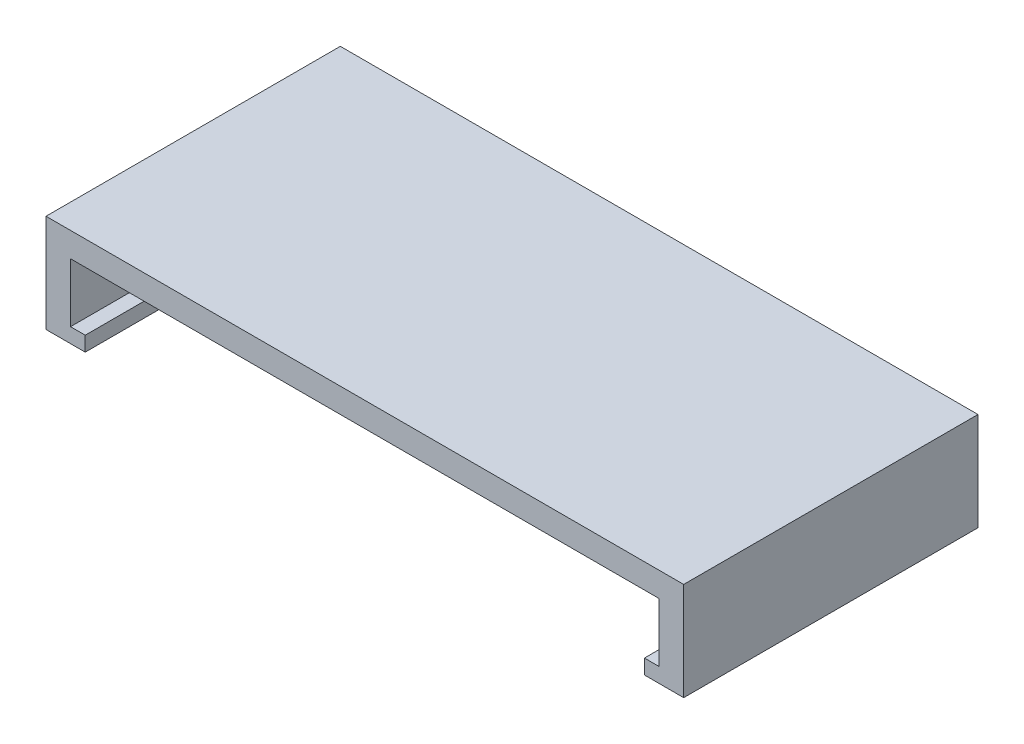
ISO-10303-21;
HEADER;
FILE_DESCRIPTION(('STEP AP214'),'2;1');
FILE_NAME('part.step','',(''),(''),'','','');
FILE_SCHEMA(('AUTOMOTIVE_DESIGN { 1 0 10303 214 1 1 1 1 }'));
ENDSEC;
DATA;
#1=APPLICATION_CONTEXT('core data for automotive mechanical design processes');
#2=APPLICATION_PROTOCOL_DEFINITION('international standard','automotive_design',2000,#1);
#3=PRODUCT_CONTEXT('',#1,'mechanical');
#4=PRODUCT('Part','Part','',(#3));
#5=PRODUCT_RELATED_PRODUCT_CATEGORY('part','',(#4));
#6=PRODUCT_DEFINITION_FORMATION('','',#4);
#7=PRODUCT_DEFINITION_CONTEXT('part definition',#1,'design');
#8=PRODUCT_DEFINITION('design','',#6,#7);
#9=PRODUCT_DEFINITION_SHAPE('','',#8);
#10=(LENGTH_UNIT() NAMED_UNIT(*) SI_UNIT(.MILLI.,.METRE.));
#11=(NAMED_UNIT(*) PLANE_ANGLE_UNIT() SI_UNIT($,.RADIAN.));
#12=(NAMED_UNIT(*) SI_UNIT($,.STERADIAN.) SOLID_ANGLE_UNIT());
#13=UNCERTAINTY_MEASURE_WITH_UNIT(LENGTH_MEASURE(1.E-05),#10,'distance_accuracy_value','');
#14=(GEOMETRIC_REPRESENTATION_CONTEXT(3) GLOBAL_UNCERTAINTY_ASSIGNED_CONTEXT((#13)) GLOBAL_UNIT_ASSIGNED_CONTEXT((#10,
#11,#12)) REPRESENTATION_CONTEXT('',''));
#15=CARTESIAN_POINT('',(0.,0.,0.));
#16=DIRECTION('',(0.,0.,1.));
#17=DIRECTION('',(1.,0.,0.));
#18=AXIS2_PLACEMENT_3D('',#15,#16,#17);
#19=CARTESIAN_POINT('',(61.,0.,30.));
#20=DIRECTION('',(-1.,0.,0.));
#21=DIRECTION('',(0.,0.,1.));
#22=AXIS2_PLACEMENT_3D('',#19,#20,#21);
#23=PLANE('',#22);
#24=DIRECTION('',(0.,1.,0.));
#25=VECTOR('',#24,1.);
#26=CARTESIAN_POINT('',(61.,0.,0.));
#27=LINE('',#26,#25);
#28=CARTESIAN_POINT('',(61.,0.,0.));
#29=VERTEX_POINT('',#28);
#30=CARTESIAN_POINT('',(61.,1.5,0.));
#31=VERTEX_POINT('',#30);
#32=EDGE_CURVE('E159',#29,#31,#27,.T.);
#33=ORIENTED_EDGE('',*,*,#32,.F.);
#34=DIRECTION('',(0.,0.,-1.));
#35=VECTOR('',#34,1.);
#36=CARTESIAN_POINT('',(61.,0.,30.));
#37=LINE('',#36,#35);
#38=CARTESIAN_POINT('',(61.,0.,30.));
#39=VERTEX_POINT('',#38);
#40=EDGE_CURVE('E11',#39,#29,#37,.T.);
#41=ORIENTED_EDGE('',*,*,#40,.F.);
#42=DIRECTION('',(0.,1.,0.));
#43=VECTOR('',#42,1.);
#44=CARTESIAN_POINT('',(61.,0.,30.));
#45=LINE('',#44,#43);
#46=CARTESIAN_POINT('',(61.,1.5,30.));
#47=VERTEX_POINT('',#46);
#48=EDGE_CURVE('E189',#39,#47,#45,.T.);
#49=ORIENTED_EDGE('',*,*,#48,.T.);
#50=DIRECTION('',(0.,0.,-1.));
#51=VECTOR('',#50,1.);
#52=CARTESIAN_POINT('',(61.,1.5,30.));
#53=LINE('',#52,#51);
#54=EDGE_CURVE('E103',#47,#31,#53,.T.);
#55=ORIENTED_EDGE('',*,*,#54,.T.);
#56=EDGE_LOOP('',(#33,#41,#49,#55));
#57=FACE_BOUND('',#56,.T.);
#58=ADVANCED_FACE('F41',(#57),#23,.T.);
#59=CARTESIAN_POINT('',(0.,0.,30.));
#60=DIRECTION('',(0.,-1.,0.));
#61=DIRECTION('',(1.,0.,0.));
#62=AXIS2_PLACEMENT_3D('',#59,#60,#61);
#63=PLANE('',#62);
#64=DIRECTION('',(-1.,0.,0.));
#65=VECTOR('',#64,1.);
#66=CARTESIAN_POINT('',(0.,0.,0.));
#67=LINE('',#66,#65);
#68=CARTESIAN_POINT('',(65.,0.,0.));
#69=VERTEX_POINT('',#68);
#70=EDGE_CURVE('E162',#69,#29,#67,.T.);
#71=ORIENTED_EDGE('',*,*,#70,.F.);
#72=DIRECTION('',(0.,0.,-1.));
#73=VECTOR('',#72,1.);
#74=CARTESIAN_POINT('',(65.,0.,30.));
#75=LINE('',#74,#73);
#76=CARTESIAN_POINT('',(65.,0.,30.));
#77=VERTEX_POINT('',#76);
#78=EDGE_CURVE('E49',#77,#69,#75,.T.);
#79=ORIENTED_EDGE('',*,*,#78,.F.);
#80=DIRECTION('',(-1.,0.,0.));
#81=VECTOR('',#80,1.);
#82=CARTESIAN_POINT('',(0.,0.,30.));
#83=LINE('',#82,#81);
#84=EDGE_CURVE('E219',#77,#39,#83,.T.);
#85=ORIENTED_EDGE('',*,*,#84,.T.);
#86=ORIENTED_EDGE('',*,*,#40,.T.);
#87=EDGE_LOOP('',(#71,#79,#85,#86));
#88=FACE_BOUND('',#87,.T.);
#89=ADVANCED_FACE('F218',(#88),#63,.T.);
#90=CARTESIAN_POINT('',(65.,0.,30.));
#91=DIRECTION('',(-1.,0.,0.));
#92=DIRECTION('',(0.,0.,1.));
#93=AXIS2_PLACEMENT_3D('',#90,#91,#92);
#94=PLANE('',#93);
#95=DIRECTION('',(0.,1.,0.));
#96=VECTOR('',#95,1.);
#97=CARTESIAN_POINT('',(65.,0.,0.));
#98=LINE('',#97,#96);
#99=CARTESIAN_POINT('',(65.,10.,0.));
#100=VERTEX_POINT('',#99);
#101=EDGE_CURVE('E165',#69,#100,#98,.T.);
#102=ORIENTED_EDGE('',*,*,#101,.T.);
#103=DIRECTION('',(0.,0.,-1.));
#104=VECTOR('',#103,1.);
#105=CARTESIAN_POINT('',(65.,10.,30.));
#106=LINE('',#105,#104);
#107=CARTESIAN_POINT('',(65.,10.,30.));
#108=VERTEX_POINT('',#107);
#109=EDGE_CURVE('E204',#108,#100,#106,.T.);
#110=ORIENTED_EDGE('',*,*,#109,.F.);
#111=DIRECTION('',(0.,1.,0.));
#112=VECTOR('',#111,1.);
#113=CARTESIAN_POINT('',(65.,0.,30.));
#114=LINE('',#113,#112);
#115=EDGE_CURVE('E210',#77,#108,#114,.T.);
#116=ORIENTED_EDGE('',*,*,#115,.F.);
#117=ORIENTED_EDGE('',*,*,#78,.T.);
#118=EDGE_LOOP('',(#102,#110,#116,#117));
#119=FACE_BOUND('',#118,.T.);
#120=ADVANCED_FACE('F208',(#119),#94,.F.);
#121=CARTESIAN_POINT('',(0.,10.,30.));
#122=DIRECTION('',(0.,1.,0.));
#123=DIRECTION('',(0.,0.,1.));
#124=AXIS2_PLACEMENT_3D('',#121,#122,#123);
#125=PLANE('',#124);
#126=DIRECTION('',(1.,0.,0.));
#127=VECTOR('',#126,1.);
#128=CARTESIAN_POINT('',(0.,10.,0.));
#129=LINE('',#128,#127);
#130=CARTESIAN_POINT('',(0.,10.,0.));
#131=VERTEX_POINT('',#130);
#132=EDGE_CURVE('E168',#131,#100,#129,.T.);
#133=ORIENTED_EDGE('',*,*,#132,.F.);
#134=DIRECTION('',(0.,0.,-1.));
#135=VECTOR('',#134,1.);
#136=CARTESIAN_POINT('',(0.,10.,30.));
#137=LINE('',#136,#135);
#138=CARTESIAN_POINT('',(0.,10.,30.));
#139=VERTEX_POINT('',#138);
#140=EDGE_CURVE('E202',#139,#131,#137,.T.);
#141=ORIENTED_EDGE('',*,*,#140,.F.);
#142=DIRECTION('',(1.,0.,0.));
#143=VECTOR('',#142,1.);
#144=CARTESIAN_POINT('',(0.,10.,30.));
#145=LINE('',#144,#143);
#146=EDGE_CURVE('E225',#139,#108,#145,.T.);
#147=ORIENTED_EDGE('',*,*,#146,.T.);
#148=ORIENTED_EDGE('',*,*,#109,.T.);
#149=EDGE_LOOP('',(#133,#141,#147,#148));
#150=FACE_BOUND('',#149,.T.);
#151=ADVANCED_FACE('F267',(#150),#125,.T.);
#152=CARTESIAN_POINT('',(0.,0.,30.));
#153=DIRECTION('',(-1.,0.,0.));
#154=DIRECTION('',(0.,0.,1.));
#155=AXIS2_PLACEMENT_3D('',#152,#153,#154);
#156=PLANE('',#155);
#157=DIRECTION('',(0.,1.,0.));
#158=VECTOR('',#157,1.);
#159=CARTESIAN_POINT('',(0.,0.,0.));
#160=LINE('',#159,#158);
#161=CARTESIAN_POINT('',(0.,0.,0.));
#162=VERTEX_POINT('',#161);
#163=EDGE_CURVE('E171',#162,#131,#160,.T.);
#164=ORIENTED_EDGE('',*,*,#163,.F.);
#165=DIRECTION('',(0.,0.,-1.));
#166=VECTOR('',#165,1.);
#167=CARTESIAN_POINT('',(0.,0.,30.));
#168=LINE('',#167,#166);
#169=CARTESIAN_POINT('',(0.,0.,30.));
#170=VERTEX_POINT('',#169);
#171=EDGE_CURVE('E200',#170,#162,#168,.T.);
#172=ORIENTED_EDGE('',*,*,#171,.F.);
#173=DIRECTION('',(0.,1.,0.));
#174=VECTOR('',#173,1.);
#175=CARTESIAN_POINT('',(0.,0.,30.));
#176=LINE('',#175,#174);
#177=EDGE_CURVE('E228',#170,#139,#176,.T.);
#178=ORIENTED_EDGE('',*,*,#177,.T.);
#179=ORIENTED_EDGE('',*,*,#140,.T.);
#180=EDGE_LOOP('',(#164,#172,#178,#179));
#181=FACE_BOUND('',#180,.T.);
#182=ADVANCED_FACE('F272',(#181),#156,.T.);
#183=CARTESIAN_POINT('',(0.,0.,30.));
#184=DIRECTION('',(0.,1.,0.));
#185=DIRECTION('',(-1.,0.,0.));
#186=AXIS2_PLACEMENT_3D('',#183,#184,#185);
#187=PLANE('',#186);
#188=DIRECTION('',(1.,0.,0.));
#189=VECTOR('',#188,1.);
#190=CARTESIAN_POINT('',(0.,0.,0.));
#191=LINE('',#190,#189);
#192=CARTESIAN_POINT('',(4.,0.,0.));
#193=VERTEX_POINT('',#192);
#194=EDGE_CURVE('E174',#162,#193,#191,.T.);
#195=ORIENTED_EDGE('',*,*,#194,.T.);
#196=DIRECTION('',(0.,0.,-1.));
#197=VECTOR('',#196,1.);
#198=CARTESIAN_POINT('',(4.,0.,30.));
#199=LINE('',#198,#197);
#200=CARTESIAN_POINT('',(4.,0.,30.));
#201=VERTEX_POINT('',#200);
#202=EDGE_CURVE('E197',#201,#193,#199,.T.);
#203=ORIENTED_EDGE('',*,*,#202,.F.);
#204=DIRECTION('',(1.,0.,0.));
#205=VECTOR('',#204,1.);
#206=CARTESIAN_POINT('',(0.,0.,30.));
#207=LINE('',#206,#205);
#208=EDGE_CURVE('E231',#170,#201,#207,.T.);
#209=ORIENTED_EDGE('',*,*,#208,.F.);
#210=ORIENTED_EDGE('',*,*,#171,.T.);
#211=EDGE_LOOP('',(#195,#203,#209,#210));
#212=FACE_BOUND('',#211,.T.);
#213=ADVANCED_FACE('F276',(#212),#187,.F.);
#214=CARTESIAN_POINT('',(4.,0.,30.));
#215=DIRECTION('',(-1.,0.,0.));
#216=DIRECTION('',(0.,0.,1.));
#217=AXIS2_PLACEMENT_3D('',#214,#215,#216);
#218=PLANE('',#217);
#219=DIRECTION('',(0.,1.,0.));
#220=VECTOR('',#219,1.);
#221=CARTESIAN_POINT('',(4.,0.,0.));
#222=LINE('',#221,#220);
#223=CARTESIAN_POINT('',(4.,1.5,0.));
#224=VERTEX_POINT('',#223);
#225=EDGE_CURVE('E176',#193,#224,#222,.T.);
#226=ORIENTED_EDGE('',*,*,#225,.T.);
#227=DIRECTION('',(0.,0.,-1.));
#228=VECTOR('',#227,1.);
#229=CARTESIAN_POINT('',(4.,1.5,30.));
#230=LINE('',#229,#228);
#231=CARTESIAN_POINT('',(4.,1.5,30.));
#232=VERTEX_POINT('',#231);
#233=EDGE_CURVE('E195',#232,#224,#230,.T.);
#234=ORIENTED_EDGE('',*,*,#233,.F.);
#235=DIRECTION('',(0.,1.,0.));
#236=VECTOR('',#235,1.);
#237=CARTESIAN_POINT('',(4.,0.,30.));
#238=LINE('',#237,#236);
#239=EDGE_CURVE('E233',#201,#232,#238,.T.);
#240=ORIENTED_EDGE('',*,*,#239,.F.);
#241=ORIENTED_EDGE('',*,*,#202,.T.);
#242=EDGE_LOOP('',(#226,#234,#240,#241));
#243=FACE_BOUND('',#242,.T.);
#244=ADVANCED_FACE('F246',(#243),#218,.F.);
#245=CARTESIAN_POINT('',(0.,1.5,30.));
#246=DIRECTION('',(0.,1.,0.));
#247=DIRECTION('',(0.,0.,1.));
#248=AXIS2_PLACEMENT_3D('',#245,#246,#247);
#249=PLANE('',#248);
#250=DIRECTION('',(1.,0.,0.));
#251=VECTOR('',#250,1.);
#252=CARTESIAN_POINT('',(0.,1.5,0.));
#253=LINE('',#252,#251);
#254=CARTESIAN_POINT('',(2.5,1.5,0.));
#255=VERTEX_POINT('',#254);
#256=EDGE_CURVE('E179',#255,#224,#253,.T.);
#257=ORIENTED_EDGE('',*,*,#256,.F.);
#258=DIRECTION('',(0.,0.,-1.));
#259=VECTOR('',#258,1.);
#260=CARTESIAN_POINT('',(2.5,1.5,30.));
#261=LINE('',#260,#259);
#262=CARTESIAN_POINT('',(2.5,1.5,30.));
#263=VERTEX_POINT('',#262);
#264=EDGE_CURVE('E193',#263,#255,#261,.T.);
#265=ORIENTED_EDGE('',*,*,#264,.F.);
#266=DIRECTION('',(1.,0.,0.));
#267=VECTOR('',#266,1.);
#268=CARTESIAN_POINT('',(0.,1.5,30.));
#269=LINE('',#268,#267);
#270=EDGE_CURVE('E235',#263,#232,#269,.T.);
#271=ORIENTED_EDGE('',*,*,#270,.T.);
#272=ORIENTED_EDGE('',*,*,#233,.T.);
#273=EDGE_LOOP('',(#257,#265,#271,#272));
#274=FACE_BOUND('',#273,.T.);
#275=ADVANCED_FACE('F239',(#274),#249,.T.);
#276=CARTESIAN_POINT('',(2.5,0.,30.));
#277=DIRECTION('',(-1.,0.,0.));
#278=DIRECTION('',(0.,0.,1.));
#279=AXIS2_PLACEMENT_3D('',#276,#277,#278);
#280=PLANE('',#279);
#281=DIRECTION('',(0.,1.,0.));
#282=VECTOR('',#281,1.);
#283=CARTESIAN_POINT('',(2.5,0.,0.));
#284=LINE('',#283,#282);
#285=CARTESIAN_POINT('',(2.5,7.5,0.));
#286=VERTEX_POINT('',#285);
#287=EDGE_CURVE('E182',#255,#286,#284,.T.);
#288=ORIENTED_EDGE('',*,*,#287,.T.);
#289=DIRECTION('',(0.,0.,-1.));
#290=VECTOR('',#289,1.);
#291=CARTESIAN_POINT('',(2.5,7.5,30.));
#292=LINE('',#291,#290);
#293=CARTESIAN_POINT('',(2.5,7.5,30.));
#294=VERTEX_POINT('',#293);
#295=EDGE_CURVE('E152',#294,#286,#292,.T.);
#296=ORIENTED_EDGE('',*,*,#295,.F.);
#297=DIRECTION('',(0.,1.,0.));
#298=VECTOR('',#297,1.);
#299=CARTESIAN_POINT('',(2.5,0.,30.));
#300=LINE('',#299,#298);
#301=EDGE_CURVE('E139',#263,#294,#300,.T.);
#302=ORIENTED_EDGE('',*,*,#301,.F.);
#303=ORIENTED_EDGE('',*,*,#264,.T.);
#304=EDGE_LOOP('',(#288,#296,#302,#303));
#305=FACE_BOUND('',#304,.T.);
#306=ADVANCED_FACE('F251',(#305),#280,.F.);
#307=CARTESIAN_POINT('',(0.,7.5,30.));
#308=DIRECTION('',(0.,1.,0.));
#309=DIRECTION('',(0.,0.,1.));
#310=AXIS2_PLACEMENT_3D('',#307,#308,#309);
#311=PLANE('',#310);
#312=DIRECTION('',(1.,0.,0.));
#313=VECTOR('',#312,1.);
#314=CARTESIAN_POINT('',(0.,7.5,0.));
#315=LINE('',#314,#313);
#316=CARTESIAN_POINT('',(62.5,7.5,0.));
#317=VERTEX_POINT('',#316);
#318=EDGE_CURVE('E148',#286,#317,#315,.T.);
#319=ORIENTED_EDGE('',*,*,#318,.T.);
#320=DIRECTION('',(0.,0.,-1.));
#321=VECTOR('',#320,1.);
#322=CARTESIAN_POINT('',(62.5,7.5,30.));
#323=LINE('',#322,#321);
#324=CARTESIAN_POINT('',(62.5,7.5,30.));
#325=VERTEX_POINT('',#324);
#326=EDGE_CURVE('E145',#325,#317,#323,.T.);
#327=ORIENTED_EDGE('',*,*,#326,.F.);
#328=DIRECTION('',(1.,0.,0.));
#329=VECTOR('',#328,1.);
#330=CARTESIAN_POINT('',(0.,7.5,30.));
#331=LINE('',#330,#329);
#332=EDGE_CURVE('E132',#294,#325,#331,.T.);
#333=ORIENTED_EDGE('',*,*,#332,.F.);
#334=ORIENTED_EDGE('',*,*,#295,.T.);
#335=EDGE_LOOP('',(#319,#327,#333,#334));
#336=FACE_BOUND('',#335,.T.);
#337=ADVANCED_FACE('F146',(#336),#311,.F.);
#338=CARTESIAN_POINT('',(62.5,0.,30.));
#339=DIRECTION('',(-1.,0.,0.));
#340=DIRECTION('',(0.,0.,1.));
#341=AXIS2_PLACEMENT_3D('',#338,#339,#340);
#342=PLANE('',#341);
#343=DIRECTION('',(0.,1.,0.));
#344=VECTOR('',#343,1.);
#345=CARTESIAN_POINT('',(62.5,0.,0.));
#346=LINE('',#345,#344);
#347=CARTESIAN_POINT('',(62.5,1.5,0.));
#348=VERTEX_POINT('',#347);
#349=EDGE_CURVE('E185',#348,#317,#346,.T.);
#350=ORIENTED_EDGE('',*,*,#349,.F.);
#351=DIRECTION('',(0.,0.,-1.));
#352=VECTOR('',#351,1.);
#353=CARTESIAN_POINT('',(62.5,1.5,30.));
#354=LINE('',#353,#352);
#355=CARTESIAN_POINT('',(62.5,1.5,30.));
#356=VERTEX_POINT('',#355);
#357=EDGE_CURVE('E96',#356,#348,#354,.T.);
#358=ORIENTED_EDGE('',*,*,#357,.F.);
#359=DIRECTION('',(0.,1.,0.));
#360=VECTOR('',#359,1.);
#361=CARTESIAN_POINT('',(62.5,0.,30.));
#362=LINE('',#361,#360);
#363=EDGE_CURVE('E136',#356,#325,#362,.T.);
#364=ORIENTED_EDGE('',*,*,#363,.T.);
#365=ORIENTED_EDGE('',*,*,#326,.T.);
#366=EDGE_LOOP('',(#350,#358,#364,#365));
#367=FACE_BOUND('',#366,.T.);
#368=ADVANCED_FACE('F154',(#367),#342,.T.);
#369=CARTESIAN_POINT('',(0.,1.49999999999998,30.));
#370=DIRECTION('',(0.,-1.,0.));
#371=DIRECTION('',(1.,0.,0.));
#372=AXIS2_PLACEMENT_3D('',#369,#370,#371);
#373=PLANE('',#372);
#374=DIRECTION('',(-1.,0.,0.));
#375=VECTOR('',#374,1.);
#376=CARTESIAN_POINT('',(0.,1.49999999999998,0.));
#377=LINE('',#376,#375);
#378=EDGE_CURVE('E187',#348,#31,#377,.T.);
#379=ORIENTED_EDGE('',*,*,#378,.T.);
#380=ORIENTED_EDGE('',*,*,#54,.F.);
#381=DIRECTION('',(-1.,0.,0.));
#382=VECTOR('',#381,1.);
#383=CARTESIAN_POINT('',(0.,1.49999999999998,30.));
#384=LINE('',#383,#382);
#385=EDGE_CURVE('E57',#356,#47,#384,.T.);
#386=ORIENTED_EDGE('',*,*,#385,.F.);
#387=ORIENTED_EDGE('',*,*,#357,.T.);
#388=EDGE_LOOP('',(#379,#380,#386,#387));
#389=FACE_BOUND('',#388,.T.);
#390=ADVANCED_FACE('F220',(#389),#373,.F.);
#391=CARTESIAN_POINT('',(0.,0.,30.));
#392=DIRECTION('',(0.,0.,1.));
#393=DIRECTION('',(1.,0.,0.));
#394=AXIS2_PLACEMENT_3D('',#391,#392,#393);
#395=PLANE('',#394);
#396=ORIENTED_EDGE('',*,*,#48,.F.);
#397=ORIENTED_EDGE('',*,*,#84,.F.);
#398=ORIENTED_EDGE('',*,*,#115,.T.);
#399=ORIENTED_EDGE('',*,*,#146,.F.);
#400=ORIENTED_EDGE('',*,*,#177,.F.);
#401=ORIENTED_EDGE('',*,*,#208,.T.);
#402=ORIENTED_EDGE('',*,*,#239,.T.);
#403=ORIENTED_EDGE('',*,*,#270,.F.);
#404=ORIENTED_EDGE('',*,*,#301,.T.);
#405=ORIENTED_EDGE('',*,*,#332,.T.);
#406=ORIENTED_EDGE('',*,*,#363,.F.);
#407=ORIENTED_EDGE('',*,*,#385,.T.);
#408=EDGE_LOOP('',(#396,#397,#398,#399,#400,#401,#402,#403,#404,#405,#406,#407));
#409=FACE_BOUND('',#408,.T.);
#410=ADVANCED_FACE('F134',(#409),#395,.T.);
#411=CARTESIAN_POINT('',(0.,0.,0.));
#412=DIRECTION('',(0.,0.,1.));
#413=DIRECTION('',(1.,0.,0.));
#414=AXIS2_PLACEMENT_3D('',#411,#412,#413);
#415=PLANE('',#414);
#416=ORIENTED_EDGE('',*,*,#32,.T.);
#417=ORIENTED_EDGE('',*,*,#378,.F.);
#418=ORIENTED_EDGE('',*,*,#349,.T.);
#419=ORIENTED_EDGE('',*,*,#318,.F.);
#420=ORIENTED_EDGE('',*,*,#287,.F.);
#421=ORIENTED_EDGE('',*,*,#256,.T.);
#422=ORIENTED_EDGE('',*,*,#225,.F.);
#423=ORIENTED_EDGE('',*,*,#194,.F.);
#424=ORIENTED_EDGE('',*,*,#163,.T.);
#425=ORIENTED_EDGE('',*,*,#132,.T.);
#426=ORIENTED_EDGE('',*,*,#101,.F.);
#427=ORIENTED_EDGE('',*,*,#70,.T.);
#428=EDGE_LOOP('',(#416,#417,#418,#419,#420,#421,#422,#423,#424,#425,#426,#427));
#429=FACE_BOUND('',#428,.T.);
#430=ADVANCED_FACE('F216',(#429),#415,.F.);
#431=CLOSED_SHELL('',(#58,#89,#120,#151,#182,#213,#244,#275,#306,#337,#368,#390,#410,#430));
#432=MANIFOLD_SOLID_BREP('B2',#431);
#433=ADVANCED_BREP_SHAPE_REPRESENTATION('',(#18,#432),#14);
#434=SHAPE_DEFINITION_REPRESENTATION(#9,#433);
ENDSEC;
END-ISO-10303-21;
